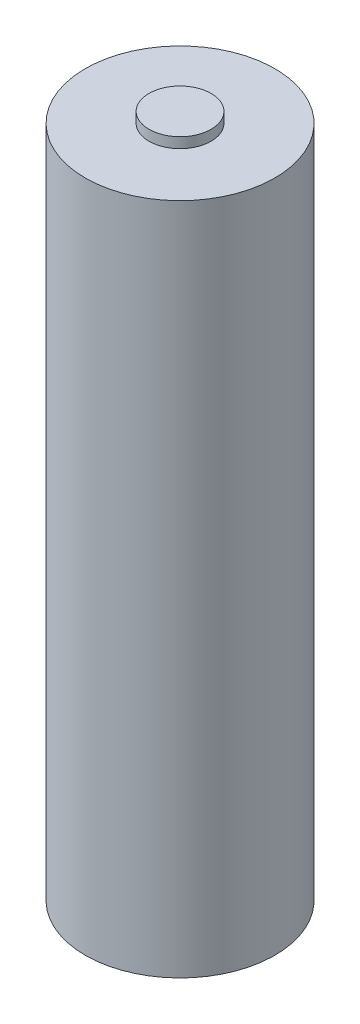
ISO-10303-21;
HEADER;
FILE_DESCRIPTION(('STEP AP214'),'2;1');
FILE_NAME('part.step','',(''),(''),'','','');
FILE_SCHEMA(('AUTOMOTIVE_DESIGN { 1 0 10303 214 1 1 1 1 }'));
ENDSEC;
DATA;
#1=APPLICATION_CONTEXT('core data for automotive mechanical design processes');
#2=APPLICATION_PROTOCOL_DEFINITION('international standard','automotive_design',2000,#1);
#3=PRODUCT_CONTEXT('',#1,'mechanical');
#4=PRODUCT('Part','Part','',(#3));
#5=PRODUCT_RELATED_PRODUCT_CATEGORY('part','',(#4));
#6=PRODUCT_DEFINITION_FORMATION('','',#4);
#7=PRODUCT_DEFINITION_CONTEXT('part definition',#1,'design');
#8=PRODUCT_DEFINITION('design','',#6,#7);
#9=PRODUCT_DEFINITION_SHAPE('','',#8);
#10=(LENGTH_UNIT() NAMED_UNIT(*) SI_UNIT(.MILLI.,.METRE.));
#11=(NAMED_UNIT(*) PLANE_ANGLE_UNIT() SI_UNIT($,.RADIAN.));
#12=(NAMED_UNIT(*) SI_UNIT($,.STERADIAN.) SOLID_ANGLE_UNIT());
#13=UNCERTAINTY_MEASURE_WITH_UNIT(LENGTH_MEASURE(1.E-05),#10,'distance_accuracy_value','');
#14=(GEOMETRIC_REPRESENTATION_CONTEXT(3) GLOBAL_UNCERTAINTY_ASSIGNED_CONTEXT((#13)) GLOBAL_UNIT_ASSIGNED_CONTEXT((#10,
#11,#12)) REPRESENTATION_CONTEXT('',''));
#15=CARTESIAN_POINT('',(0.,0.,0.));
#16=DIRECTION('',(0.,0.,1.));
#17=DIRECTION('',(1.,0.,0.));
#18=AXIS2_PLACEMENT_3D('',#15,#16,#17);
#19=CARTESIAN_POINT('',(0.,65.,0.));
#20=DIRECTION('',(0.,-1.,0.));
#21=DIRECTION('',(0.,0.,-1.));
#22=AXIS2_PLACEMENT_3D('',#19,#20,#21);
#23=CYLINDRICAL_SURFACE('',#22,9.15);
#24=CARTESIAN_POINT('',(0.,65.,0.));
#25=DIRECTION('',(0.,1.,0.));
#26=DIRECTION('',(0.,0.,1.));
#27=AXIS2_PLACEMENT_3D('',#24,#25,#26);
#28=CIRCLE('',#27,9.15);
#29=CARTESIAN_POINT('',(0.,65.,9.15));
#30=VERTEX_POINT('',#29);
#31=EDGE_CURVE('E46',#30,#30,#28,.T.);
#32=ORIENTED_EDGE('',*,*,#31,.F.);
#33=EDGE_LOOP('',(#32));
#34=FACE_BOUND('',#33,.T.);
#35=CARTESIAN_POINT('',(0.,0.,0.));
#36=DIRECTION('',(0.,1.,0.));
#37=DIRECTION('',(0.,0.,1.));
#38=AXIS2_PLACEMENT_3D('',#35,#36,#37);
#39=CIRCLE('',#38,9.15);
#40=CARTESIAN_POINT('',(0.,0.,9.15));
#41=VERTEX_POINT('',#40);
#42=EDGE_CURVE('E42',#41,#41,#39,.T.);
#43=ORIENTED_EDGE('',*,*,#42,.T.);
#44=EDGE_LOOP('',(#43));
#45=FACE_BOUND('',#44,.T.);
#46=ADVANCED_FACE('F39',(#34,#45),#23,.T.);
#47=CARTESIAN_POINT('',(0.,65.,0.));
#48=DIRECTION('',(0.,1.,0.));
#49=DIRECTION('',(0.,0.,1.));
#50=AXIS2_PLACEMENT_3D('',#47,#48,#49);
#51=PLANE('',#50);
#52=CARTESIAN_POINT('',(0.,65.,0.));
#53=DIRECTION('',(0.,1.,0.));
#54=DIRECTION('',(0.,0.,1.));
#55=AXIS2_PLACEMENT_3D('',#52,#53,#54);
#56=CIRCLE('',#55,3.);
#57=CARTESIAN_POINT('',(0.,65.,3.));
#58=VERTEX_POINT('',#57);
#59=EDGE_CURVE('E10',#58,#58,#56,.T.);
#60=ORIENTED_EDGE('',*,*,#59,.F.);
#61=EDGE_LOOP('',(#60));
#62=FACE_BOUND('',#61,.T.);
#63=ORIENTED_EDGE('',*,*,#31,.T.);
#64=EDGE_LOOP('',(#63));
#65=FACE_BOUND('',#64,.T.);
#66=ADVANCED_FACE('F63',(#62,#65),#51,.T.);
#67=CARTESIAN_POINT('',(0.,0.,0.));
#68=DIRECTION('',(0.,1.,0.));
#69=DIRECTION('',(0.,0.,1.));
#70=AXIS2_PLACEMENT_3D('',#67,#68,#69);
#71=PLANE('',#70);
#72=ORIENTED_EDGE('',*,*,#42,.F.);
#73=EDGE_LOOP('',(#72));
#74=FACE_BOUND('',#73,.T.);
#75=ADVANCED_FACE('F60',(#74),#71,.F.);
#76=CARTESIAN_POINT('',(0.,66.,0.));
#77=DIRECTION('',(0.,-1.,0.));
#78=DIRECTION('',(0.,0.,-1.));
#79=AXIS2_PLACEMENT_3D('',#76,#77,#78);
#80=CYLINDRICAL_SURFACE('',#79,3.);
#81=CARTESIAN_POINT('',(0.,66.,0.));
#82=DIRECTION('',(0.,1.,0.));
#83=DIRECTION('',(0.,0.,1.));
#84=AXIS2_PLACEMENT_3D('',#81,#82,#83);
#85=CIRCLE('',#84,3.);
#86=CARTESIAN_POINT('',(0.,66.,3.));
#87=VERTEX_POINT('',#86);
#88=EDGE_CURVE('E52',#87,#87,#85,.T.);
#89=ORIENTED_EDGE('',*,*,#88,.F.);
#90=EDGE_LOOP('',(#89));
#91=FACE_BOUND('',#90,.T.);
#92=ORIENTED_EDGE('',*,*,#59,.T.);
#93=EDGE_LOOP('',(#92));
#94=FACE_BOUND('',#93,.T.);
#95=ADVANCED_FACE('F62',(#91,#94),#80,.T.);
#96=CARTESIAN_POINT('',(0.,66.,0.));
#97=DIRECTION('',(0.,1.,0.));
#98=DIRECTION('',(0.,0.,1.));
#99=AXIS2_PLACEMENT_3D('',#96,#97,#98);
#100=PLANE('',#99);
#101=ORIENTED_EDGE('',*,*,#88,.T.);
#102=EDGE_LOOP('',(#101));
#103=FACE_BOUND('',#102,.T.);
#104=ADVANCED_FACE('F68',(#103),#100,.T.);
#105=CLOSED_SHELL('',(#46,#66,#75,#95,#104));
#106=MANIFOLD_SOLID_BREP('B2',#105);
#107=ADVANCED_BREP_SHAPE_REPRESENTATION('',(#18,#106),#14);
#108=SHAPE_DEFINITION_REPRESENTATION(#9,#107);
ENDSEC;
END-ISO-10303-21;
